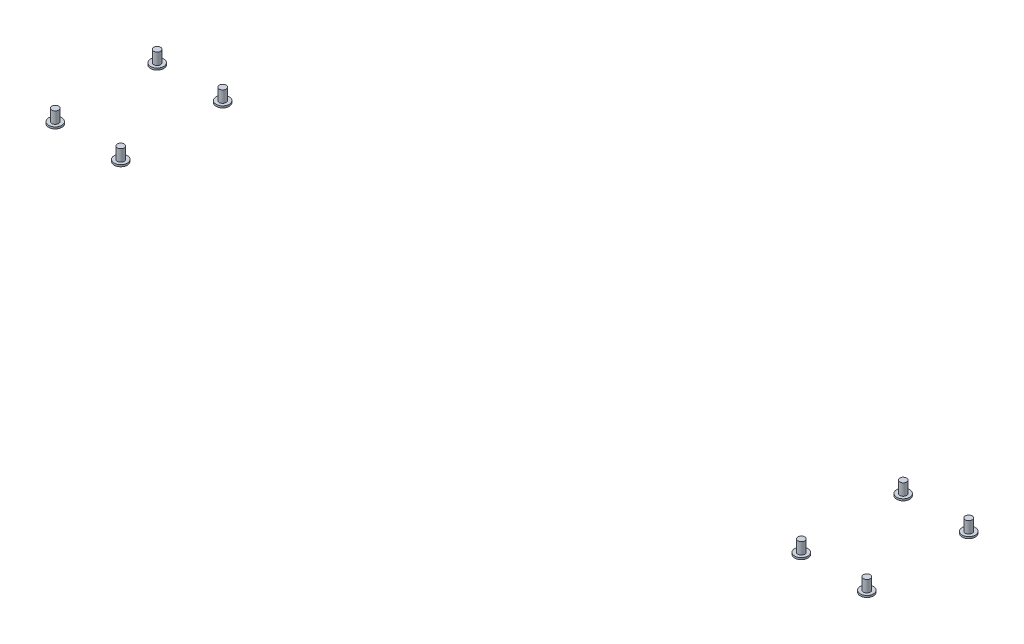
ISO-10303-21;
HEADER;
FILE_DESCRIPTION(('STEP AP214'),'2;1');
FILE_NAME('part.step','',(''),(''),'','','');
FILE_SCHEMA(('AUTOMOTIVE_DESIGN { 1 0 10303 214 1 1 1 1 }'));
ENDSEC;
DATA;
#1=APPLICATION_CONTEXT('core data for automotive mechanical design processes');
#2=APPLICATION_PROTOCOL_DEFINITION('international standard','automotive_design',2000,#1);
#3=PRODUCT_CONTEXT('',#1,'mechanical');
#4=PRODUCT('Part','Part','',(#3));
#5=PRODUCT_RELATED_PRODUCT_CATEGORY('part','',(#4));
#6=PRODUCT_DEFINITION_FORMATION('','',#4);
#7=PRODUCT_DEFINITION_CONTEXT('part definition',#1,'design');
#8=PRODUCT_DEFINITION('design','',#6,#7);
#9=PRODUCT_DEFINITION_SHAPE('','',#8);
#10=(LENGTH_UNIT() NAMED_UNIT(*) SI_UNIT(.MILLI.,.METRE.));
#11=(NAMED_UNIT(*) PLANE_ANGLE_UNIT() SI_UNIT($,.RADIAN.));
#12=(NAMED_UNIT(*) SI_UNIT($,.STERADIAN.) SOLID_ANGLE_UNIT());
#13=UNCERTAINTY_MEASURE_WITH_UNIT(LENGTH_MEASURE(1.E-05),#10,'distance_accuracy_value','');
#14=(GEOMETRIC_REPRESENTATION_CONTEXT(3) GLOBAL_UNCERTAINTY_ASSIGNED_CONTEXT((#13)) GLOBAL_UNIT_ASSIGNED_CONTEXT((#10,
#11,#12)) REPRESENTATION_CONTEXT('',''));
#15=CARTESIAN_POINT('',(0.,0.,0.));
#16=DIRECTION('',(0.,0.,1.));
#17=DIRECTION('',(1.,0.,0.));
#18=AXIS2_PLACEMENT_3D('',#15,#16,#17);
#19=CARTESIAN_POINT('',(-223.,-203.6,48.));
#20=DIRECTION('',(0.,1.,0.));
#21=DIRECTION('',(0.,0.,1.));
#22=AXIS2_PLACEMENT_3D('',#19,#20,#21);
#23=PLANE('',#22);
#24=CARTESIAN_POINT('',(-223.,-203.6,48.));
#25=DIRECTION('',(0.,-1.,0.));
#26=DIRECTION('',(0.,0.,-1.));
#27=AXIS2_PLACEMENT_3D('',#24,#25,#26);
#28=CIRCLE('',#27,1.9);
#29=CARTESIAN_POINT('',(-223.,-203.6,46.1));
#30=VERTEX_POINT('',#29);
#31=EDGE_CURVE('P0_E23',#30,#30,#28,.T.);
#32=ORIENTED_EDGE('',*,*,#31,.F.);
#33=EDGE_LOOP('',(#32));
#34=FACE_BOUND('',#33,.T.);
#35=ADVANCED_FACE('P0_F15',(#34),#23,.T.);
#36=CARTESIAN_POINT('',(-223.,-210.05,48.));
#37=DIRECTION('',(0.,1.,0.));
#38=DIRECTION('',(0.,0.,1.));
#39=AXIS2_PLACEMENT_3D('',#36,#37,#38);
#40=CYLINDRICAL_SURFACE('',#39,1.9);
#41=CARTESIAN_POINT('',(-223.,-210.,48.));
#42=DIRECTION('',(0.,1.,0.));
#43=DIRECTION('',(0.,0.,1.));
#44=AXIS2_PLACEMENT_3D('',#41,#42,#43);
#45=CIRCLE('',#44,1.9);
#46=CARTESIAN_POINT('',(-223.,-210.,49.9));
#47=VERTEX_POINT('',#46);
#48=EDGE_CURVE('P0_E10',#47,#47,#45,.F.);
#49=ORIENTED_EDGE('',*,*,#48,.F.);
#50=EDGE_LOOP('',(#49));
#51=FACE_BOUND('',#50,.T.);
#52=ORIENTED_EDGE('',*,*,#31,.T.);
#53=EDGE_LOOP('',(#52));
#54=FACE_BOUND('',#53,.T.);
#55=ADVANCED_FACE('P0_F17',(#51,#54),#40,.T.);
#56=CARTESIAN_POINT('',(-223.,-210.,48.));
#57=DIRECTION('',(0.,1.,0.));
#58=DIRECTION('',(0.,0.,1.));
#59=AXIS2_PLACEMENT_3D('',#56,#57,#58);
#60=PLANE('',#59);
#61=ORIENTED_EDGE('',*,*,#48,.T.);
#62=EDGE_LOOP('',(#61));
#63=FACE_BOUND('',#62,.T.);
#64=CARTESIAN_POINT('',(-223.,-210.,48.));
#65=DIRECTION('',(0.,-1.,0.));
#66=DIRECTION('',(0.,0.,-1.));
#67=AXIS2_PLACEMENT_3D('',#64,#65,#66);
#68=CIRCLE('',#67,3.6);
#69=CARTESIAN_POINT('',(-223.,-210.,44.4));
#70=VERTEX_POINT('',#69);
#71=EDGE_CURVE('P0_E29',#70,#70,#68,.T.);
#72=ORIENTED_EDGE('',*,*,#71,.F.);
#73=EDGE_LOOP('',(#72));
#74=FACE_BOUND('',#73,.T.);
#75=ADVANCED_FACE('P0_F45',(#63,#74),#60,.T.);
#76=CARTESIAN_POINT('',(-223.,-211.,48.));
#77=DIRECTION('',(0.,-1.,0.));
#78=DIRECTION('',(0.,0.,-1.));
#79=AXIS2_PLACEMENT_3D('',#76,#77,#78);
#80=PLANE('',#79);
#81=CARTESIAN_POINT('',(-223.,-211.,48.));
#82=DIRECTION('',(0.,1.,0.));
#83=DIRECTION('',(0.,0.,1.));
#84=AXIS2_PLACEMENT_3D('',#81,#82,#83);
#85=CIRCLE('',#84,3.6);
#86=CARTESIAN_POINT('',(-223.,-211.,51.6));
#87=VERTEX_POINT('',#86);
#88=EDGE_CURVE('P0_E34',#87,#87,#85,.T.);
#89=ORIENTED_EDGE('',*,*,#88,.F.);
#90=EDGE_LOOP('',(#89));
#91=FACE_BOUND('',#90,.T.);
#92=ADVANCED_FACE('P0_F43',(#91),#80,.T.);
#93=CARTESIAN_POINT('',(-223.,-211.,48.));
#94=DIRECTION('',(0.,1.,0.));
#95=DIRECTION('',(0.,0.,1.));
#96=AXIS2_PLACEMENT_3D('',#93,#94,#95);
#97=CYLINDRICAL_SURFACE('',#96,3.6);
#98=ORIENTED_EDGE('',*,*,#71,.T.);
#99=EDGE_LOOP('',(#98));
#100=FACE_BOUND('',#99,.T.);
#101=ORIENTED_EDGE('',*,*,#88,.T.);
#102=EDGE_LOOP('',(#101));
#103=FACE_BOUND('',#102,.T.);
#104=ADVANCED_FACE('P0_F41',(#100,#103),#97,.T.);
#105=CLOSED_SHELL('',(#35,#55,#75,#92,#104));
#106=MANIFOLD_SOLID_BREP('P0_B1',#105);
#107=CARTESIAN_POINT('',(-223.,-203.6,104.));
#108=DIRECTION('',(0.,1.,0.));
#109=DIRECTION('',(0.,0.,1.));
#110=AXIS2_PLACEMENT_3D('',#107,#108,#109);
#111=PLANE('',#110);
#112=CARTESIAN_POINT('',(-223.,-203.6,104.));
#113=DIRECTION('',(0.,-1.,0.));
#114=DIRECTION('',(0.,0.,-1.));
#115=AXIS2_PLACEMENT_3D('',#112,#113,#114);
#116=CIRCLE('',#115,1.9);
#117=CARTESIAN_POINT('',(-223.,-203.6,102.1));
#118=VERTEX_POINT('',#117);
#119=EDGE_CURVE('P1_E23',#118,#118,#116,.T.);
#120=ORIENTED_EDGE('',*,*,#119,.F.);
#121=EDGE_LOOP('',(#120));
#122=FACE_BOUND('',#121,.T.);
#123=ADVANCED_FACE('P1_F15',(#122),#111,.T.);
#124=CARTESIAN_POINT('',(-223.,-210.05,104.));
#125=DIRECTION('',(0.,1.,0.));
#126=DIRECTION('',(0.,0.,1.));
#127=AXIS2_PLACEMENT_3D('',#124,#125,#126);
#128=CYLINDRICAL_SURFACE('',#127,1.9);
#129=CARTESIAN_POINT('',(-223.,-210.,104.));
#130=DIRECTION('',(0.,1.,0.));
#131=DIRECTION('',(0.,0.,1.));
#132=AXIS2_PLACEMENT_3D('',#129,#130,#131);
#133=CIRCLE('',#132,1.9);
#134=CARTESIAN_POINT('',(-223.,-210.,105.9));
#135=VERTEX_POINT('',#134);
#136=EDGE_CURVE('P1_E10',#135,#135,#133,.F.);
#137=ORIENTED_EDGE('',*,*,#136,.F.);
#138=EDGE_LOOP('',(#137));
#139=FACE_BOUND('',#138,.T.);
#140=ORIENTED_EDGE('',*,*,#119,.T.);
#141=EDGE_LOOP('',(#140));
#142=FACE_BOUND('',#141,.T.);
#143=ADVANCED_FACE('P1_F17',(#139,#142),#128,.T.);
#144=CARTESIAN_POINT('',(-223.,-210.,104.));
#145=DIRECTION('',(0.,1.,0.));
#146=DIRECTION('',(0.,0.,1.));
#147=AXIS2_PLACEMENT_3D('',#144,#145,#146);
#148=PLANE('',#147);
#149=ORIENTED_EDGE('',*,*,#136,.T.);
#150=EDGE_LOOP('',(#149));
#151=FACE_BOUND('',#150,.T.);
#152=CARTESIAN_POINT('',(-223.,-210.,104.));
#153=DIRECTION('',(0.,-1.,0.));
#154=DIRECTION('',(0.,0.,-1.));
#155=AXIS2_PLACEMENT_3D('',#152,#153,#154);
#156=CIRCLE('',#155,3.6);
#157=CARTESIAN_POINT('',(-223.,-210.,100.4));
#158=VERTEX_POINT('',#157);
#159=EDGE_CURVE('P1_E30',#158,#158,#156,.T.);
#160=ORIENTED_EDGE('',*,*,#159,.F.);
#161=EDGE_LOOP('',(#160));
#162=FACE_BOUND('',#161,.T.);
#163=ADVANCED_FACE('P1_F45',(#151,#162),#148,.T.);
#164=CARTESIAN_POINT('',(-223.,-211.,104.));
#165=DIRECTION('',(0.,-1.,0.));
#166=DIRECTION('',(0.,0.,-1.));
#167=AXIS2_PLACEMENT_3D('',#164,#165,#166);
#168=PLANE('',#167);
#169=CARTESIAN_POINT('',(-223.,-211.,104.));
#170=DIRECTION('',(0.,1.,0.));
#171=DIRECTION('',(0.,0.,1.));
#172=AXIS2_PLACEMENT_3D('',#169,#170,#171);
#173=CIRCLE('',#172,3.6);
#174=CARTESIAN_POINT('',(-223.,-211.,107.6));
#175=VERTEX_POINT('',#174);
#176=EDGE_CURVE('P1_E35',#175,#175,#173,.T.);
#177=ORIENTED_EDGE('',*,*,#176,.F.);
#178=EDGE_LOOP('',(#177));
#179=FACE_BOUND('',#178,.T.);
#180=ADVANCED_FACE('P1_F43',(#179),#168,.T.);
#181=CARTESIAN_POINT('',(-223.,-211.,104.));
#182=DIRECTION('',(0.,1.,0.));
#183=DIRECTION('',(0.,0.,1.));
#184=AXIS2_PLACEMENT_3D('',#181,#182,#183);
#185=CYLINDRICAL_SURFACE('',#184,3.6);
#186=ORIENTED_EDGE('',*,*,#159,.T.);
#187=EDGE_LOOP('',(#186));
#188=FACE_BOUND('',#187,.T.);
#189=ORIENTED_EDGE('',*,*,#176,.T.);
#190=EDGE_LOOP('',(#189));
#191=FACE_BOUND('',#190,.T.);
#192=ADVANCED_FACE('P1_F41',(#188,#191),#185,.T.);
#193=CLOSED_SHELL('',(#123,#143,#163,#180,#192));
#194=MANIFOLD_SOLID_BREP('P1_B1',#193);
#195=CARTESIAN_POINT('',(-187.,-203.6,48.));
#196=DIRECTION('',(0.,1.,0.));
#197=DIRECTION('',(0.,0.,1.));
#198=AXIS2_PLACEMENT_3D('',#195,#196,#197);
#199=PLANE('',#198);
#200=CARTESIAN_POINT('',(-187.,-203.6,48.));
#201=DIRECTION('',(0.,-1.,0.));
#202=DIRECTION('',(0.,0.,-1.));
#203=AXIS2_PLACEMENT_3D('',#200,#201,#202);
#204=CIRCLE('',#203,1.9);
#205=CARTESIAN_POINT('',(-187.,-203.6,46.1));
#206=VERTEX_POINT('',#205);
#207=EDGE_CURVE('P2_E23',#206,#206,#204,.T.);
#208=ORIENTED_EDGE('',*,*,#207,.F.);
#209=EDGE_LOOP('',(#208));
#210=FACE_BOUND('',#209,.T.);
#211=ADVANCED_FACE('P2_F15',(#210),#199,.T.);
#212=CARTESIAN_POINT('',(-187.,-210.05,48.));
#213=DIRECTION('',(0.,1.,0.));
#214=DIRECTION('',(0.,0.,1.));
#215=AXIS2_PLACEMENT_3D('',#212,#213,#214);
#216=CYLINDRICAL_SURFACE('',#215,1.9);
#217=CARTESIAN_POINT('',(-187.,-210.,48.));
#218=DIRECTION('',(0.,1.,0.));
#219=DIRECTION('',(0.,0.,1.));
#220=AXIS2_PLACEMENT_3D('',#217,#218,#219);
#221=CIRCLE('',#220,1.9);
#222=CARTESIAN_POINT('',(-187.,-210.,49.9));
#223=VERTEX_POINT('',#222);
#224=EDGE_CURVE('P2_E10',#223,#223,#221,.F.);
#225=ORIENTED_EDGE('',*,*,#224,.F.);
#226=EDGE_LOOP('',(#225));
#227=FACE_BOUND('',#226,.T.);
#228=ORIENTED_EDGE('',*,*,#207,.T.);
#229=EDGE_LOOP('',(#228));
#230=FACE_BOUND('',#229,.T.);
#231=ADVANCED_FACE('P2_F17',(#227,#230),#216,.T.);
#232=CARTESIAN_POINT('',(-187.,-210.,48.));
#233=DIRECTION('',(0.,1.,0.));
#234=DIRECTION('',(0.,0.,1.));
#235=AXIS2_PLACEMENT_3D('',#232,#233,#234);
#236=PLANE('',#235);
#237=ORIENTED_EDGE('',*,*,#224,.T.);
#238=EDGE_LOOP('',(#237));
#239=FACE_BOUND('',#238,.T.);
#240=CARTESIAN_POINT('',(-187.,-210.,48.));
#241=DIRECTION('',(0.,-1.,0.));
#242=DIRECTION('',(0.,0.,-1.));
#243=AXIS2_PLACEMENT_3D('',#240,#241,#242);
#244=CIRCLE('',#243,3.6);
#245=CARTESIAN_POINT('',(-187.,-210.,44.4));
#246=VERTEX_POINT('',#245);
#247=EDGE_CURVE('P2_E30',#246,#246,#244,.T.);
#248=ORIENTED_EDGE('',*,*,#247,.F.);
#249=EDGE_LOOP('',(#248));
#250=FACE_BOUND('',#249,.T.);
#251=ADVANCED_FACE('P2_F45',(#239,#250),#236,.T.);
#252=CARTESIAN_POINT('',(-187.,-211.,48.));
#253=DIRECTION('',(0.,-1.,0.));
#254=DIRECTION('',(0.,0.,-1.));
#255=AXIS2_PLACEMENT_3D('',#252,#253,#254);
#256=PLANE('',#255);
#257=CARTESIAN_POINT('',(-187.,-211.,48.));
#258=DIRECTION('',(0.,1.,0.));
#259=DIRECTION('',(0.,0.,1.));
#260=AXIS2_PLACEMENT_3D('',#257,#258,#259);
#261=CIRCLE('',#260,3.6);
#262=CARTESIAN_POINT('',(-187.,-211.,51.6));
#263=VERTEX_POINT('',#262);
#264=EDGE_CURVE('P2_E34',#263,#263,#261,.T.);
#265=ORIENTED_EDGE('',*,*,#264,.F.);
#266=EDGE_LOOP('',(#265));
#267=FACE_BOUND('',#266,.T.);
#268=ADVANCED_FACE('P2_F43',(#267),#256,.T.);
#269=CARTESIAN_POINT('',(-187.,-211.,48.));
#270=DIRECTION('',(0.,1.,0.));
#271=DIRECTION('',(0.,0.,1.));
#272=AXIS2_PLACEMENT_3D('',#269,#270,#271);
#273=CYLINDRICAL_SURFACE('',#272,3.6);
#274=ORIENTED_EDGE('',*,*,#247,.T.);
#275=EDGE_LOOP('',(#274));
#276=FACE_BOUND('',#275,.T.);
#277=ORIENTED_EDGE('',*,*,#264,.T.);
#278=EDGE_LOOP('',(#277));
#279=FACE_BOUND('',#278,.T.);
#280=ADVANCED_FACE('P2_F41',(#276,#279),#273,.T.);
#281=CLOSED_SHELL('',(#211,#231,#251,#268,#280));
#282=MANIFOLD_SOLID_BREP('P2_B1',#281);
#283=CARTESIAN_POINT('',(-187.,-203.6,104.));
#284=DIRECTION('',(0.,1.,0.));
#285=DIRECTION('',(0.,0.,1.));
#286=AXIS2_PLACEMENT_3D('',#283,#284,#285);
#287=PLANE('',#286);
#288=CARTESIAN_POINT('',(-187.,-203.6,104.));
#289=DIRECTION('',(0.,-1.,0.));
#290=DIRECTION('',(0.,0.,-1.));
#291=AXIS2_PLACEMENT_3D('',#288,#289,#290);
#292=CIRCLE('',#291,1.9);
#293=CARTESIAN_POINT('',(-187.,-203.6,102.1));
#294=VERTEX_POINT('',#293);
#295=EDGE_CURVE('P3_E23',#294,#294,#292,.T.);
#296=ORIENTED_EDGE('',*,*,#295,.F.);
#297=EDGE_LOOP('',(#296));
#298=FACE_BOUND('',#297,.T.);
#299=ADVANCED_FACE('P3_F15',(#298),#287,.T.);
#300=CARTESIAN_POINT('',(-187.,-210.05,104.));
#301=DIRECTION('',(0.,1.,0.));
#302=DIRECTION('',(0.,0.,1.));
#303=AXIS2_PLACEMENT_3D('',#300,#301,#302);
#304=CYLINDRICAL_SURFACE('',#303,1.9);
#305=CARTESIAN_POINT('',(-187.,-210.,104.));
#306=DIRECTION('',(0.,1.,0.));
#307=DIRECTION('',(0.,0.,1.));
#308=AXIS2_PLACEMENT_3D('',#305,#306,#307);
#309=CIRCLE('',#308,1.9);
#310=CARTESIAN_POINT('',(-187.,-210.,105.9));
#311=VERTEX_POINT('',#310);
#312=EDGE_CURVE('P3_E10',#311,#311,#309,.F.);
#313=ORIENTED_EDGE('',*,*,#312,.F.);
#314=EDGE_LOOP('',(#313));
#315=FACE_BOUND('',#314,.T.);
#316=ORIENTED_EDGE('',*,*,#295,.T.);
#317=EDGE_LOOP('',(#316));
#318=FACE_BOUND('',#317,.T.);
#319=ADVANCED_FACE('P3_F17',(#315,#318),#304,.T.);
#320=CARTESIAN_POINT('',(-187.,-210.,104.));
#321=DIRECTION('',(0.,1.,0.));
#322=DIRECTION('',(0.,0.,1.));
#323=AXIS2_PLACEMENT_3D('',#320,#321,#322);
#324=PLANE('',#323);
#325=ORIENTED_EDGE('',*,*,#312,.T.);
#326=EDGE_LOOP('',(#325));
#327=FACE_BOUND('',#326,.T.);
#328=CARTESIAN_POINT('',(-187.,-210.,104.));
#329=DIRECTION('',(0.,-1.,0.));
#330=DIRECTION('',(0.,0.,-1.));
#331=AXIS2_PLACEMENT_3D('',#328,#329,#330);
#332=CIRCLE('',#331,3.6);
#333=CARTESIAN_POINT('',(-187.,-210.,100.4));
#334=VERTEX_POINT('',#333);
#335=EDGE_CURVE('P3_E29',#334,#334,#332,.T.);
#336=ORIENTED_EDGE('',*,*,#335,.F.);
#337=EDGE_LOOP('',(#336));
#338=FACE_BOUND('',#337,.T.);
#339=ADVANCED_FACE('P3_F45',(#327,#338),#324,.T.);
#340=CARTESIAN_POINT('',(-187.,-211.,104.));
#341=DIRECTION('',(0.,-1.,0.));
#342=DIRECTION('',(0.,0.,-1.));
#343=AXIS2_PLACEMENT_3D('',#340,#341,#342);
#344=PLANE('',#343);
#345=CARTESIAN_POINT('',(-187.,-211.,104.));
#346=DIRECTION('',(0.,1.,0.));
#347=DIRECTION('',(0.,0.,1.));
#348=AXIS2_PLACEMENT_3D('',#345,#346,#347);
#349=CIRCLE('',#348,3.6);
#350=CARTESIAN_POINT('',(-187.,-211.,107.6));
#351=VERTEX_POINT('',#350);
#352=EDGE_CURVE('P3_E35',#351,#351,#349,.T.);
#353=ORIENTED_EDGE('',*,*,#352,.F.);
#354=EDGE_LOOP('',(#353));
#355=FACE_BOUND('',#354,.T.);
#356=ADVANCED_FACE('P3_F43',(#355),#344,.T.);
#357=CARTESIAN_POINT('',(-187.,-211.,104.));
#358=DIRECTION('',(0.,1.,0.));
#359=DIRECTION('',(0.,0.,1.));
#360=AXIS2_PLACEMENT_3D('',#357,#358,#359);
#361=CYLINDRICAL_SURFACE('',#360,3.6);
#362=ORIENTED_EDGE('',*,*,#335,.T.);
#363=EDGE_LOOP('',(#362));
#364=FACE_BOUND('',#363,.T.);
#365=ORIENTED_EDGE('',*,*,#352,.T.);
#366=EDGE_LOOP('',(#365));
#367=FACE_BOUND('',#366,.T.);
#368=ADVANCED_FACE('P3_F41',(#364,#367),#361,.T.);
#369=CLOSED_SHELL('',(#299,#319,#339,#356,#368));
#370=MANIFOLD_SOLID_BREP('P3_B1',#369);
#371=CARTESIAN_POINT('',(187.,-203.6,48.));
#372=DIRECTION('',(0.,1.,0.));
#373=DIRECTION('',(0.,0.,1.));
#374=AXIS2_PLACEMENT_3D('',#371,#372,#373);
#375=PLANE('',#374);
#376=CARTESIAN_POINT('',(187.,-203.6,48.));
#377=DIRECTION('',(0.,-1.,0.));
#378=DIRECTION('',(0.,0.,-1.));
#379=AXIS2_PLACEMENT_3D('',#376,#377,#378);
#380=CIRCLE('',#379,1.9);
#381=CARTESIAN_POINT('',(187.,-203.6,46.1));
#382=VERTEX_POINT('',#381);
#383=EDGE_CURVE('P4_E23',#382,#382,#380,.T.);
#384=ORIENTED_EDGE('',*,*,#383,.F.);
#385=EDGE_LOOP('',(#384));
#386=FACE_BOUND('',#385,.T.);
#387=ADVANCED_FACE('P4_F15',(#386),#375,.T.);
#388=CARTESIAN_POINT('',(187.,-210.05,48.));
#389=DIRECTION('',(0.,1.,0.));
#390=DIRECTION('',(0.,0.,1.));
#391=AXIS2_PLACEMENT_3D('',#388,#389,#390);
#392=CYLINDRICAL_SURFACE('',#391,1.9);
#393=CARTESIAN_POINT('',(187.,-210.,48.));
#394=DIRECTION('',(0.,1.,0.));
#395=DIRECTION('',(0.,0.,1.));
#396=AXIS2_PLACEMENT_3D('',#393,#394,#395);
#397=CIRCLE('',#396,1.9);
#398=CARTESIAN_POINT('',(187.,-210.,49.9));
#399=VERTEX_POINT('',#398);
#400=EDGE_CURVE('P4_E10',#399,#399,#397,.F.);
#401=ORIENTED_EDGE('',*,*,#400,.F.);
#402=EDGE_LOOP('',(#401));
#403=FACE_BOUND('',#402,.T.);
#404=ORIENTED_EDGE('',*,*,#383,.T.);
#405=EDGE_LOOP('',(#404));
#406=FACE_BOUND('',#405,.T.);
#407=ADVANCED_FACE('P4_F17',(#403,#406),#392,.T.);
#408=CARTESIAN_POINT('',(187.,-210.,48.));
#409=DIRECTION('',(0.,1.,0.));
#410=DIRECTION('',(0.,0.,1.));
#411=AXIS2_PLACEMENT_3D('',#408,#409,#410);
#412=PLANE('',#411);
#413=ORIENTED_EDGE('',*,*,#400,.T.);
#414=EDGE_LOOP('',(#413));
#415=FACE_BOUND('',#414,.T.);
#416=CARTESIAN_POINT('',(187.,-210.,48.));
#417=DIRECTION('',(0.,-1.,0.));
#418=DIRECTION('',(0.,0.,-1.));
#419=AXIS2_PLACEMENT_3D('',#416,#417,#418);
#420=CIRCLE('',#419,3.6);
#421=CARTESIAN_POINT('',(187.,-210.,44.4));
#422=VERTEX_POINT('',#421);
#423=EDGE_CURVE('P4_E30',#422,#422,#420,.T.);
#424=ORIENTED_EDGE('',*,*,#423,.F.);
#425=EDGE_LOOP('',(#424));
#426=FACE_BOUND('',#425,.T.);
#427=ADVANCED_FACE('P4_F45',(#415,#426),#412,.T.);
#428=CARTESIAN_POINT('',(187.,-211.,48.));
#429=DIRECTION('',(0.,-1.,0.));
#430=DIRECTION('',(0.,0.,-1.));
#431=AXIS2_PLACEMENT_3D('',#428,#429,#430);
#432=PLANE('',#431);
#433=CARTESIAN_POINT('',(187.,-211.,48.));
#434=DIRECTION('',(0.,1.,0.));
#435=DIRECTION('',(0.,0.,1.));
#436=AXIS2_PLACEMENT_3D('',#433,#434,#435);
#437=CIRCLE('',#436,3.6);
#438=CARTESIAN_POINT('',(187.,-211.,51.6));
#439=VERTEX_POINT('',#438);
#440=EDGE_CURVE('P4_E35',#439,#439,#437,.T.);
#441=ORIENTED_EDGE('',*,*,#440,.F.);
#442=EDGE_LOOP('',(#441));
#443=FACE_BOUND('',#442,.T.);
#444=ADVANCED_FACE('P4_F43',(#443),#432,.T.);
#445=CARTESIAN_POINT('',(187.,-211.,48.));
#446=DIRECTION('',(0.,1.,0.));
#447=DIRECTION('',(0.,0.,1.));
#448=AXIS2_PLACEMENT_3D('',#445,#446,#447);
#449=CYLINDRICAL_SURFACE('',#448,3.6);
#450=ORIENTED_EDGE('',*,*,#423,.T.);
#451=EDGE_LOOP('',(#450));
#452=FACE_BOUND('',#451,.T.);
#453=ORIENTED_EDGE('',*,*,#440,.T.);
#454=EDGE_LOOP('',(#453));
#455=FACE_BOUND('',#454,.T.);
#456=ADVANCED_FACE('P4_F41',(#452,#455),#449,.T.);
#457=CLOSED_SHELL('',(#387,#407,#427,#444,#456));
#458=MANIFOLD_SOLID_BREP('P4_B1',#457);
#459=CARTESIAN_POINT('',(187.,-203.6,104.));
#460=DIRECTION('',(0.,1.,0.));
#461=DIRECTION('',(0.,0.,1.));
#462=AXIS2_PLACEMENT_3D('',#459,#460,#461);
#463=PLANE('',#462);
#464=CARTESIAN_POINT('',(187.,-203.6,104.));
#465=DIRECTION('',(0.,-1.,0.));
#466=DIRECTION('',(0.,0.,-1.));
#467=AXIS2_PLACEMENT_3D('',#464,#465,#466);
#468=CIRCLE('',#467,1.9);
#469=CARTESIAN_POINT('',(187.,-203.6,102.1));
#470=VERTEX_POINT('',#469);
#471=EDGE_CURVE('P5_E23',#470,#470,#468,.T.);
#472=ORIENTED_EDGE('',*,*,#471,.F.);
#473=EDGE_LOOP('',(#472));
#474=FACE_BOUND('',#473,.T.);
#475=ADVANCED_FACE('P5_F15',(#474),#463,.T.);
#476=CARTESIAN_POINT('',(187.,-210.05,104.));
#477=DIRECTION('',(0.,1.,0.));
#478=DIRECTION('',(0.,0.,1.));
#479=AXIS2_PLACEMENT_3D('',#476,#477,#478);
#480=CYLINDRICAL_SURFACE('',#479,1.9);
#481=CARTESIAN_POINT('',(187.,-210.,104.));
#482=DIRECTION('',(0.,1.,0.));
#483=DIRECTION('',(0.,0.,1.));
#484=AXIS2_PLACEMENT_3D('',#481,#482,#483);
#485=CIRCLE('',#484,1.9);
#486=CARTESIAN_POINT('',(187.,-210.,105.9));
#487=VERTEX_POINT('',#486);
#488=EDGE_CURVE('P5_E10',#487,#487,#485,.F.);
#489=ORIENTED_EDGE('',*,*,#488,.F.);
#490=EDGE_LOOP('',(#489));
#491=FACE_BOUND('',#490,.T.);
#492=ORIENTED_EDGE('',*,*,#471,.T.);
#493=EDGE_LOOP('',(#492));
#494=FACE_BOUND('',#493,.T.);
#495=ADVANCED_FACE('P5_F17',(#491,#494),#480,.T.);
#496=CARTESIAN_POINT('',(187.,-210.,104.));
#497=DIRECTION('',(0.,1.,0.));
#498=DIRECTION('',(0.,0.,1.));
#499=AXIS2_PLACEMENT_3D('',#496,#497,#498);
#500=PLANE('',#499);
#501=ORIENTED_EDGE('',*,*,#488,.T.);
#502=EDGE_LOOP('',(#501));
#503=FACE_BOUND('',#502,.T.);
#504=CARTESIAN_POINT('',(187.,-210.,104.));
#505=DIRECTION('',(0.,-1.,0.));
#506=DIRECTION('',(0.,0.,-1.));
#507=AXIS2_PLACEMENT_3D('',#504,#505,#506);
#508=CIRCLE('',#507,3.6);
#509=CARTESIAN_POINT('',(187.,-210.,100.4));
#510=VERTEX_POINT('',#509);
#511=EDGE_CURVE('P5_E30',#510,#510,#508,.T.);
#512=ORIENTED_EDGE('',*,*,#511,.F.);
#513=EDGE_LOOP('',(#512));
#514=FACE_BOUND('',#513,.T.);
#515=ADVANCED_FACE('P5_F45',(#503,#514),#500,.T.);
#516=CARTESIAN_POINT('',(187.,-211.,104.));
#517=DIRECTION('',(0.,-1.,0.));
#518=DIRECTION('',(0.,0.,-1.));
#519=AXIS2_PLACEMENT_3D('',#516,#517,#518);
#520=PLANE('',#519);
#521=CARTESIAN_POINT('',(187.,-211.,104.));
#522=DIRECTION('',(0.,1.,0.));
#523=DIRECTION('',(0.,0.,1.));
#524=AXIS2_PLACEMENT_3D('',#521,#522,#523);
#525=CIRCLE('',#524,3.6);
#526=CARTESIAN_POINT('',(187.,-211.,107.6));
#527=VERTEX_POINT('',#526);
#528=EDGE_CURVE('P5_E35',#527,#527,#525,.T.);
#529=ORIENTED_EDGE('',*,*,#528,.F.);
#530=EDGE_LOOP('',(#529));
#531=FACE_BOUND('',#530,.T.);
#532=ADVANCED_FACE('P5_F43',(#531),#520,.T.);
#533=CARTESIAN_POINT('',(187.,-211.,104.));
#534=DIRECTION('',(0.,1.,0.));
#535=DIRECTION('',(0.,0.,1.));
#536=AXIS2_PLACEMENT_3D('',#533,#534,#535);
#537=CYLINDRICAL_SURFACE('',#536,3.6);
#538=ORIENTED_EDGE('',*,*,#511,.T.);
#539=EDGE_LOOP('',(#538));
#540=FACE_BOUND('',#539,.T.);
#541=ORIENTED_EDGE('',*,*,#528,.T.);
#542=EDGE_LOOP('',(#541));
#543=FACE_BOUND('',#542,.T.);
#544=ADVANCED_FACE('P5_F41',(#540,#543),#537,.T.);
#545=CLOSED_SHELL('',(#475,#495,#515,#532,#544));
#546=MANIFOLD_SOLID_BREP('P5_B1',#545);
#547=CARTESIAN_POINT('',(223.,-203.6,48.));
#548=DIRECTION('',(0.,1.,0.));
#549=DIRECTION('',(0.,0.,1.));
#550=AXIS2_PLACEMENT_3D('',#547,#548,#549);
#551=PLANE('',#550);
#552=CARTESIAN_POINT('',(223.,-203.6,48.));
#553=DIRECTION('',(0.,-1.,0.));
#554=DIRECTION('',(0.,0.,-1.));
#555=AXIS2_PLACEMENT_3D('',#552,#553,#554);
#556=CIRCLE('',#555,1.9);
#557=CARTESIAN_POINT('',(223.,-203.6,46.1));
#558=VERTEX_POINT('',#557);
#559=EDGE_CURVE('P6_E23',#558,#558,#556,.T.);
#560=ORIENTED_EDGE('',*,*,#559,.F.);
#561=EDGE_LOOP('',(#560));
#562=FACE_BOUND('',#561,.T.);
#563=ADVANCED_FACE('P6_F15',(#562),#551,.T.);
#564=CARTESIAN_POINT('',(223.,-210.05,48.));
#565=DIRECTION('',(0.,1.,0.));
#566=DIRECTION('',(0.,0.,1.));
#567=AXIS2_PLACEMENT_3D('',#564,#565,#566);
#568=CYLINDRICAL_SURFACE('',#567,1.9);
#569=CARTESIAN_POINT('',(223.,-210.,48.));
#570=DIRECTION('',(0.,1.,0.));
#571=DIRECTION('',(0.,0.,1.));
#572=AXIS2_PLACEMENT_3D('',#569,#570,#571);
#573=CIRCLE('',#572,1.9);
#574=CARTESIAN_POINT('',(223.,-210.,49.9));
#575=VERTEX_POINT('',#574);
#576=EDGE_CURVE('P6_E10',#575,#575,#573,.F.);
#577=ORIENTED_EDGE('',*,*,#576,.F.);
#578=EDGE_LOOP('',(#577));
#579=FACE_BOUND('',#578,.T.);
#580=ORIENTED_EDGE('',*,*,#559,.T.);
#581=EDGE_LOOP('',(#580));
#582=FACE_BOUND('',#581,.T.);
#583=ADVANCED_FACE('P6_F17',(#579,#582),#568,.T.);
#584=CARTESIAN_POINT('',(223.,-210.,48.));
#585=DIRECTION('',(0.,1.,0.));
#586=DIRECTION('',(0.,0.,1.));
#587=AXIS2_PLACEMENT_3D('',#584,#585,#586);
#588=PLANE('',#587);
#589=ORIENTED_EDGE('',*,*,#576,.T.);
#590=EDGE_LOOP('',(#589));
#591=FACE_BOUND('',#590,.T.);
#592=CARTESIAN_POINT('',(223.,-210.,48.));
#593=DIRECTION('',(0.,-1.,0.));
#594=DIRECTION('',(0.,0.,-1.));
#595=AXIS2_PLACEMENT_3D('',#592,#593,#594);
#596=CIRCLE('',#595,3.6);
#597=CARTESIAN_POINT('',(223.,-210.,44.4));
#598=VERTEX_POINT('',#597);
#599=EDGE_CURVE('P6_E30',#598,#598,#596,.T.);
#600=ORIENTED_EDGE('',*,*,#599,.F.);
#601=EDGE_LOOP('',(#600));
#602=FACE_BOUND('',#601,.T.);
#603=ADVANCED_FACE('P6_F45',(#591,#602),#588,.T.);
#604=CARTESIAN_POINT('',(223.,-211.,48.));
#605=DIRECTION('',(0.,-1.,0.));
#606=DIRECTION('',(0.,0.,-1.));
#607=AXIS2_PLACEMENT_3D('',#604,#605,#606);
#608=PLANE('',#607);
#609=CARTESIAN_POINT('',(223.,-211.,48.));
#610=DIRECTION('',(0.,1.,0.));
#611=DIRECTION('',(0.,0.,1.));
#612=AXIS2_PLACEMENT_3D('',#609,#610,#611);
#613=CIRCLE('',#612,3.6);
#614=CARTESIAN_POINT('',(223.,-211.,51.6));
#615=VERTEX_POINT('',#614);
#616=EDGE_CURVE('P6_E35',#615,#615,#613,.T.);
#617=ORIENTED_EDGE('',*,*,#616,.F.);
#618=EDGE_LOOP('',(#617));
#619=FACE_BOUND('',#618,.T.);
#620=ADVANCED_FACE('P6_F43',(#619),#608,.T.);
#621=CARTESIAN_POINT('',(223.,-211.,48.));
#622=DIRECTION('',(0.,1.,0.));
#623=DIRECTION('',(0.,0.,1.));
#624=AXIS2_PLACEMENT_3D('',#621,#622,#623);
#625=CYLINDRICAL_SURFACE('',#624,3.6);
#626=ORIENTED_EDGE('',*,*,#599,.T.);
#627=EDGE_LOOP('',(#626));
#628=FACE_BOUND('',#627,.T.);
#629=ORIENTED_EDGE('',*,*,#616,.T.);
#630=EDGE_LOOP('',(#629));
#631=FACE_BOUND('',#630,.T.);
#632=ADVANCED_FACE('P6_F41',(#628,#631),#625,.T.);
#633=CLOSED_SHELL('',(#563,#583,#603,#620,#632));
#634=MANIFOLD_SOLID_BREP('P6_B1',#633);
#635=CARTESIAN_POINT('',(223.,-203.6,104.));
#636=DIRECTION('',(0.,1.,0.));
#637=DIRECTION('',(0.,0.,1.));
#638=AXIS2_PLACEMENT_3D('',#635,#636,#637);
#639=PLANE('',#638);
#640=CARTESIAN_POINT('',(223.,-203.6,104.));
#641=DIRECTION('',(0.,-1.,0.));
#642=DIRECTION('',(0.,0.,-1.));
#643=AXIS2_PLACEMENT_3D('',#640,#641,#642);
#644=CIRCLE('',#643,1.9);
#645=CARTESIAN_POINT('',(223.,-203.6,102.1));
#646=VERTEX_POINT('',#645);
#647=EDGE_CURVE('P7_E23',#646,#646,#644,.T.);
#648=ORIENTED_EDGE('',*,*,#647,.F.);
#649=EDGE_LOOP('',(#648));
#650=FACE_BOUND('',#649,.T.);
#651=ADVANCED_FACE('P7_F15',(#650),#639,.T.);
#652=CARTESIAN_POINT('',(223.,-210.05,104.));
#653=DIRECTION('',(0.,1.,0.));
#654=DIRECTION('',(0.,0.,1.));
#655=AXIS2_PLACEMENT_3D('',#652,#653,#654);
#656=CYLINDRICAL_SURFACE('',#655,1.9);
#657=CARTESIAN_POINT('',(223.,-210.,104.));
#658=DIRECTION('',(0.,1.,0.));
#659=DIRECTION('',(0.,0.,1.));
#660=AXIS2_PLACEMENT_3D('',#657,#658,#659);
#661=CIRCLE('',#660,1.9);
#662=CARTESIAN_POINT('',(223.,-210.,105.9));
#663=VERTEX_POINT('',#662);
#664=EDGE_CURVE('P7_E10',#663,#663,#661,.F.);
#665=ORIENTED_EDGE('',*,*,#664,.F.);
#666=EDGE_LOOP('',(#665));
#667=FACE_BOUND('',#666,.T.);
#668=ORIENTED_EDGE('',*,*,#647,.T.);
#669=EDGE_LOOP('',(#668));
#670=FACE_BOUND('',#669,.T.);
#671=ADVANCED_FACE('P7_F17',(#667,#670),#656,.T.);
#672=CARTESIAN_POINT('',(223.,-210.,104.));
#673=DIRECTION('',(0.,1.,0.));
#674=DIRECTION('',(0.,0.,1.));
#675=AXIS2_PLACEMENT_3D('',#672,#673,#674);
#676=PLANE('',#675);
#677=ORIENTED_EDGE('',*,*,#664,.T.);
#678=EDGE_LOOP('',(#677));
#679=FACE_BOUND('',#678,.T.);
#680=CARTESIAN_POINT('',(223.,-210.,104.));
#681=DIRECTION('',(0.,-1.,0.));
#682=DIRECTION('',(0.,0.,-1.));
#683=AXIS2_PLACEMENT_3D('',#680,#681,#682);
#684=CIRCLE('',#683,3.6);
#685=CARTESIAN_POINT('',(223.,-210.,100.4));
#686=VERTEX_POINT('',#685);
#687=EDGE_CURVE('P7_E30',#686,#686,#684,.T.);
#688=ORIENTED_EDGE('',*,*,#687,.F.);
#689=EDGE_LOOP('',(#688));
#690=FACE_BOUND('',#689,.T.);
#691=ADVANCED_FACE('P7_F45',(#679,#690),#676,.T.);
#692=CARTESIAN_POINT('',(223.,-211.,104.));
#693=DIRECTION('',(0.,-1.,0.));
#694=DIRECTION('',(0.,0.,-1.));
#695=AXIS2_PLACEMENT_3D('',#692,#693,#694);
#696=PLANE('',#695);
#697=CARTESIAN_POINT('',(223.,-211.,104.));
#698=DIRECTION('',(0.,1.,0.));
#699=DIRECTION('',(0.,0.,1.));
#700=AXIS2_PLACEMENT_3D('',#697,#698,#699);
#701=CIRCLE('',#700,3.6);
#702=CARTESIAN_POINT('',(223.,-211.,107.6));
#703=VERTEX_POINT('',#702);
#704=EDGE_CURVE('P7_E35',#703,#703,#701,.T.);
#705=ORIENTED_EDGE('',*,*,#704,.F.);
#706=EDGE_LOOP('',(#705));
#707=FACE_BOUND('',#706,.T.);
#708=ADVANCED_FACE('P7_F43',(#707),#696,.T.);
#709=CARTESIAN_POINT('',(223.,-211.,104.));
#710=DIRECTION('',(0.,1.,0.));
#711=DIRECTION('',(0.,0.,1.));
#712=AXIS2_PLACEMENT_3D('',#709,#710,#711);
#713=CYLINDRICAL_SURFACE('',#712,3.6);
#714=ORIENTED_EDGE('',*,*,#687,.T.);
#715=EDGE_LOOP('',(#714));
#716=FACE_BOUND('',#715,.T.);
#717=ORIENTED_EDGE('',*,*,#704,.T.);
#718=EDGE_LOOP('',(#717));
#719=FACE_BOUND('',#718,.T.);
#720=ADVANCED_FACE('P7_F41',(#716,#719),#713,.T.);
#721=CLOSED_SHELL('',(#651,#671,#691,#708,#720));
#722=MANIFOLD_SOLID_BREP('P7_B1',#721);
#723=ADVANCED_BREP_SHAPE_REPRESENTATION('',(#18,#106,#194,#282,#370,#458,#546,#634,#722),#14);
#724=SHAPE_DEFINITION_REPRESENTATION(#9,#723);
ENDSEC;
END-ISO-10303-21;
